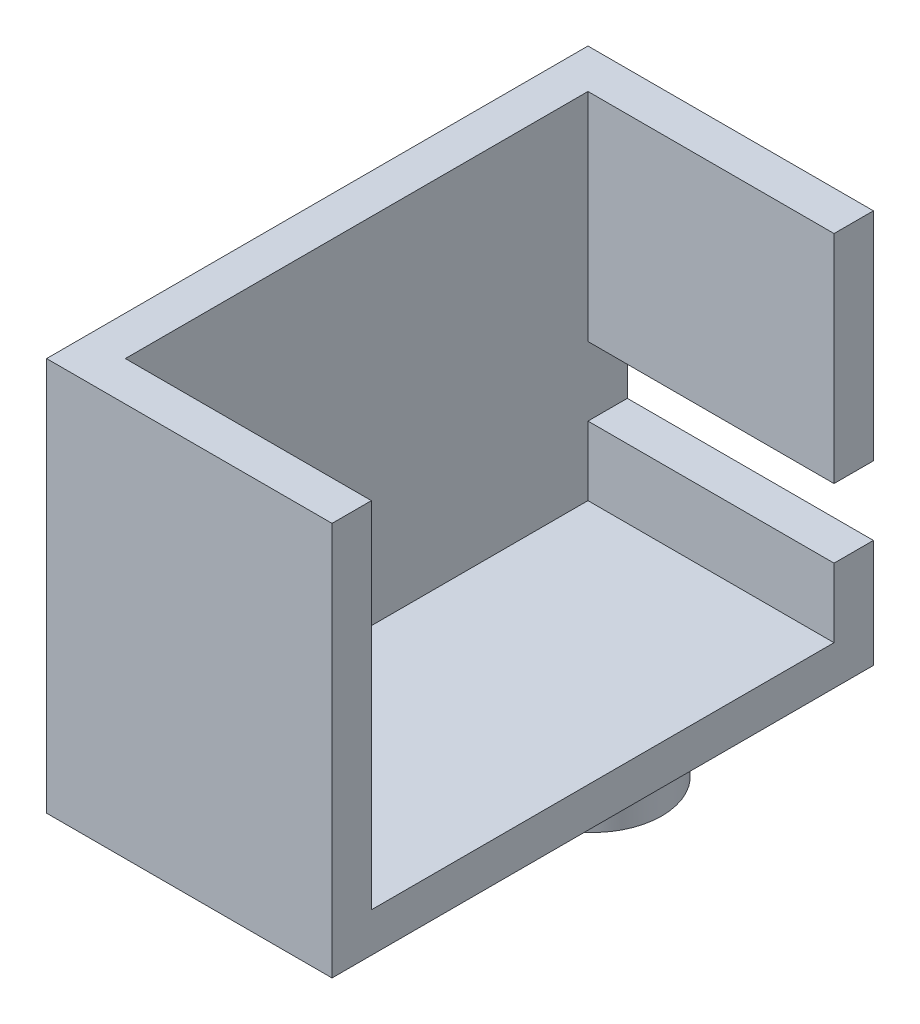
ISO-10303-21;
HEADER;
FILE_DESCRIPTION(('STEP AP214'),'2;1');
FILE_NAME('part.step','',(''),(''),'','','');
FILE_SCHEMA(('AUTOMOTIVE_DESIGN { 1 0 10303 214 1 1 1 1 }'));
ENDSEC;
DATA;
#1=APPLICATION_CONTEXT('core data for automotive mechanical design processes');
#2=APPLICATION_PROTOCOL_DEFINITION('international standard','automotive_design',2000,#1);
#3=PRODUCT_CONTEXT('',#1,'mechanical');
#4=PRODUCT('Part','Part','',(#3));
#5=PRODUCT_RELATED_PRODUCT_CATEGORY('part','',(#4));
#6=PRODUCT_DEFINITION_FORMATION('','',#4);
#7=PRODUCT_DEFINITION_CONTEXT('part definition',#1,'design');
#8=PRODUCT_DEFINITION('design','',#6,#7);
#9=PRODUCT_DEFINITION_SHAPE('','',#8);
#10=(LENGTH_UNIT() NAMED_UNIT(*) SI_UNIT(.MILLI.,.METRE.));
#11=(NAMED_UNIT(*) PLANE_ANGLE_UNIT() SI_UNIT($,.RADIAN.));
#12=(NAMED_UNIT(*) SI_UNIT($,.STERADIAN.) SOLID_ANGLE_UNIT());
#13=UNCERTAINTY_MEASURE_WITH_UNIT(LENGTH_MEASURE(1.E-05),#10,'distance_accuracy_value','');
#14=(GEOMETRIC_REPRESENTATION_CONTEXT(3) GLOBAL_UNCERTAINTY_ASSIGNED_CONTEXT((#13)) GLOBAL_UNIT_ASSIGNED_CONTEXT((#10,
#11,#12)) REPRESENTATION_CONTEXT('',''));
#15=CARTESIAN_POINT('',(0.,0.,0.));
#16=DIRECTION('',(0.,0.,1.));
#17=DIRECTION('',(1.,0.,0.));
#18=AXIS2_PLACEMENT_3D('',#15,#16,#17);
#19=CARTESIAN_POINT('',(12.5,0.,0.));
#20=DIRECTION('',(1.,0.,0.));
#21=DIRECTION('',(0.,0.,-1.));
#22=AXIS2_PLACEMENT_3D('',#19,#20,#21);
#23=PLANE('',#22);
#24=DIRECTION('',(0.,0.,-1.));
#25=VECTOR('',#24,1.);
#26=CARTESIAN_POINT('',(12.5,18.,0.));
#27=LINE('',#26,#25);
#28=CARTESIAN_POINT('',(12.5,18.,25.5));
#29=VERTEX_POINT('',#28);
#30=CARTESIAN_POINT('',(12.5,18.,23.5));
#31=VERTEX_POINT('',#30);
#32=EDGE_CURVE('E218',#29,#31,#27,.T.);
#33=ORIENTED_EDGE('',*,*,#32,.F.);
#34=DIRECTION('',(0.,-1.,0.));
#35=VECTOR('',#34,1.);
#36=CARTESIAN_POINT('',(12.5,0.,25.5));
#37=LINE('',#36,#35);
#38=CARTESIAN_POINT('',(12.5,-2.,25.5));
#39=VERTEX_POINT('',#38);
#40=EDGE_CURVE('E168',#29,#39,#37,.T.);
#41=ORIENTED_EDGE('',*,*,#40,.T.);
#42=DIRECTION('',(0.,0.,-1.));
#43=VECTOR('',#42,1.);
#44=CARTESIAN_POINT('',(12.5,-2.,0.));
#45=LINE('',#44,#43);
#46=CARTESIAN_POINT('',(12.5,-2.,-2.));
#47=VERTEX_POINT('',#46);
#48=EDGE_CURVE('E159',#39,#47,#45,.T.);
#49=ORIENTED_EDGE('',*,*,#48,.T.);
#50=DIRECTION('',(0.,1.,0.));
#51=VECTOR('',#50,1.);
#52=CARTESIAN_POINT('',(12.5,0.,-2.));
#53=LINE('',#52,#51);
#54=CARTESIAN_POINT('',(12.5,3.5,-2.));
#55=VERTEX_POINT('',#54);
#56=EDGE_CURVE('E165',#47,#55,#53,.T.);
#57=ORIENTED_EDGE('',*,*,#56,.T.);
#58=DIRECTION('',(0.,0.,-1.));
#59=VECTOR('',#58,1.);
#60=CARTESIAN_POINT('',(12.5,3.5,-2.));
#61=LINE('',#60,#59);
#62=CARTESIAN_POINT('',(12.5,3.5,0.));
#63=VERTEX_POINT('',#62);
#64=EDGE_CURVE('E190',#63,#55,#61,.T.);
#65=ORIENTED_EDGE('',*,*,#64,.F.);
#66=DIRECTION('',(0.,1.,0.));
#67=VECTOR('',#66,1.);
#68=CARTESIAN_POINT('',(12.5,0.,0.));
#69=LINE('',#68,#67);
#70=CARTESIAN_POINT('',(12.5,0.,0.));
#71=VERTEX_POINT('',#70);
#72=EDGE_CURVE('E196',#71,#63,#69,.T.);
#73=ORIENTED_EDGE('',*,*,#72,.F.);
#74=DIRECTION('',(0.,0.,-1.));
#75=VECTOR('',#74,1.);
#76=CARTESIAN_POINT('',(12.5,0.,0.));
#77=LINE('',#76,#75);
#78=CARTESIAN_POINT('',(12.5,0.,23.5));
#79=VERTEX_POINT('',#78);
#80=EDGE_CURVE('E202',#79,#71,#77,.T.);
#81=ORIENTED_EDGE('',*,*,#80,.F.);
#82=DIRECTION('',(0.,-1.,0.));
#83=VECTOR('',#82,1.);
#84=CARTESIAN_POINT('',(12.5,0.,23.5));
#85=LINE('',#84,#83);
#86=EDGE_CURVE('E199',#31,#79,#85,.T.);
#87=ORIENTED_EDGE('',*,*,#86,.F.);
#88=EDGE_LOOP('',(#33,#41,#49,#57,#65,#73,#81,#87));
#89=FACE_BOUND('',#88,.T.);
#90=ADVANCED_FACE('F34',(#89),#23,.T.);
#91=CARTESIAN_POINT('',(12.5,0.,-2.));
#92=DIRECTION('',(0.,0.,1.));
#93=DIRECTION('',(1.,0.,0.));
#94=AXIS2_PLACEMENT_3D('',#91,#92,#93);
#95=PLANE('',#94);
#96=DIRECTION('',(0.,1.,0.));
#97=VECTOR('',#96,1.);
#98=CARTESIAN_POINT('',(-2.,0.,-2.));
#99=LINE('',#98,#97);
#100=CARTESIAN_POINT('',(-2.,-2.,-2.));
#101=VERTEX_POINT('',#100);
#102=CARTESIAN_POINT('',(-2.,18.,-2.));
#103=VERTEX_POINT('',#102);
#104=EDGE_CURVE('E141',#101,#103,#99,.T.);
#105=ORIENTED_EDGE('',*,*,#104,.T.);
#106=DIRECTION('',(-1.,0.,0.));
#107=VECTOR('',#106,1.);
#108=CARTESIAN_POINT('',(-2.,18.,-2.));
#109=LINE('',#108,#107);
#110=CARTESIAN_POINT('',(12.5,18.,-2.));
#111=VERTEX_POINT('',#110);
#112=EDGE_CURVE('E124',#111,#103,#109,.T.);
#113=ORIENTED_EDGE('',*,*,#112,.F.);
#114=CARTESIAN_POINT('',(12.5,7.,-2.));
#115=VERTEX_POINT('',#114);
#116=EDGE_CURVE('E164',#115,#111,#53,.T.);
#117=ORIENTED_EDGE('',*,*,#116,.F.);
#118=DIRECTION('',(-1.,0.,0.));
#119=VECTOR('',#118,1.);
#120=CARTESIAN_POINT('',(12.5,7.,-2.));
#121=LINE('',#120,#119);
#122=CARTESIAN_POINT('',(0.,7.,-2.));
#123=VERTEX_POINT('',#122);
#124=EDGE_CURVE('E185',#115,#123,#121,.T.);
#125=ORIENTED_EDGE('',*,*,#124,.T.);
#126=DIRECTION('',(0.,1.,0.));
#127=VECTOR('',#126,1.);
#128=CARTESIAN_POINT('',(0.,7.,-2.));
#129=LINE('',#128,#127);
#130=CARTESIAN_POINT('',(0.,3.5,-2.));
#131=VERTEX_POINT('',#130);
#132=EDGE_CURVE('E182',#131,#123,#129,.T.);
#133=ORIENTED_EDGE('',*,*,#132,.F.);
#134=DIRECTION('',(-1.,0.,0.));
#135=VECTOR('',#134,1.);
#136=CARTESIAN_POINT('',(12.5,3.5,-2.));
#137=LINE('',#136,#135);
#138=EDGE_CURVE('E180',#55,#131,#137,.T.);
#139=ORIENTED_EDGE('',*,*,#138,.F.);
#140=ORIENTED_EDGE('',*,*,#56,.F.);
#141=DIRECTION('',(-1.,0.,0.));
#142=VECTOR('',#141,1.);
#143=CARTESIAN_POINT('',(12.5,-2.,-2.));
#144=LINE('',#143,#142);
#145=EDGE_CURVE('E149',#47,#101,#144,.T.);
#146=ORIENTED_EDGE('',*,*,#145,.T.);
#147=EDGE_LOOP('',(#105,#113,#117,#125,#133,#139,#140,#146));
#148=FACE_BOUND('',#147,.T.);
#149=ADVANCED_FACE('F146',(#148),#95,.F.);
#150=CARTESIAN_POINT('',(12.5,18.,0.));
#151=VERTEX_POINT('',#150);
#152=EDGE_CURVE('E130',#151,#111,#27,.T.);
#153=ORIENTED_EDGE('',*,*,#152,.F.);
#154=CARTESIAN_POINT('',(12.5,7.,0.));
#155=VERTEX_POINT('',#154);
#156=EDGE_CURVE('E200',#155,#151,#69,.T.);
#157=ORIENTED_EDGE('',*,*,#156,.F.);
#158=DIRECTION('',(0.,0.,1.));
#159=VECTOR('',#158,1.);
#160=CARTESIAN_POINT('',(12.5,7.,0.));
#161=LINE('',#160,#159);
#162=EDGE_CURVE('E234',#115,#155,#161,.T.);
#163=ORIENTED_EDGE('',*,*,#162,.F.);
#164=ORIENTED_EDGE('',*,*,#116,.T.);
#165=EDGE_LOOP('',(#153,#157,#163,#164));
#166=FACE_BOUND('',#165,.T.);
#167=ADVANCED_FACE('F245',(#166),#23,.T.);
#168=CARTESIAN_POINT('',(12.5,0.,0.));
#169=DIRECTION('',(0.,0.,1.));
#170=DIRECTION('',(1.,0.,0.));
#171=AXIS2_PLACEMENT_3D('',#168,#169,#170);
#172=PLANE('',#171);
#173=DIRECTION('',(0.,1.,0.));
#174=VECTOR('',#173,1.);
#175=CARTESIAN_POINT('',(0.,0.,0.));
#176=LINE('',#175,#174);
#177=CARTESIAN_POINT('',(0.,7.,0.));
#178=VERTEX_POINT('',#177);
#179=CARTESIAN_POINT('',(0.,18.,0.));
#180=VERTEX_POINT('',#179);
#181=EDGE_CURVE('E195',#178,#180,#176,.T.);
#182=ORIENTED_EDGE('',*,*,#181,.F.);
#183=DIRECTION('',(-1.,0.,0.));
#184=VECTOR('',#183,1.);
#185=CARTESIAN_POINT('',(12.5,7.,0.));
#186=LINE('',#185,#184);
#187=EDGE_CURVE('E188',#155,#178,#186,.T.);
#188=ORIENTED_EDGE('',*,*,#187,.F.);
#189=ORIENTED_EDGE('',*,*,#156,.T.);
#190=DIRECTION('',(-1.,0.,0.));
#191=VECTOR('',#190,1.);
#192=CARTESIAN_POINT('',(12.5,18.,0.));
#193=LINE('',#192,#191);
#194=EDGE_CURVE('E150',#151,#180,#193,.T.);
#195=ORIENTED_EDGE('',*,*,#194,.T.);
#196=EDGE_LOOP('',(#182,#188,#189,#195));
#197=FACE_BOUND('',#196,.T.);
#198=ADVANCED_FACE('F249',(#197),#172,.T.);
#199=ORIENTED_EDGE('',*,*,#72,.T.);
#200=DIRECTION('',(-1.,0.,0.));
#201=VECTOR('',#200,1.);
#202=CARTESIAN_POINT('',(12.5,3.5,0.));
#203=LINE('',#202,#201);
#204=CARTESIAN_POINT('',(0.,3.5,0.));
#205=VERTEX_POINT('',#204);
#206=EDGE_CURVE('E184',#63,#205,#203,.T.);
#207=ORIENTED_EDGE('',*,*,#206,.T.);
#208=CARTESIAN_POINT('',(0.,0.,0.));
#209=VERTEX_POINT('',#208);
#210=EDGE_CURVE('E205',#209,#205,#176,.T.);
#211=ORIENTED_EDGE('',*,*,#210,.F.);
#212=DIRECTION('',(-1.,0.,0.));
#213=VECTOR('',#212,1.);
#214=CARTESIAN_POINT('',(12.5,0.,0.));
#215=LINE('',#214,#213);
#216=EDGE_CURVE('E204',#71,#209,#215,.T.);
#217=ORIENTED_EDGE('',*,*,#216,.F.);
#218=EDGE_LOOP('',(#199,#207,#211,#217));
#219=FACE_BOUND('',#218,.T.);
#220=ADVANCED_FACE('F231',(#219),#172,.T.);
#221=CARTESIAN_POINT('',(12.5,0.,25.5));
#222=DIRECTION('',(0.,0.,-1.));
#223=DIRECTION('',(-1.,0.,0.));
#224=AXIS2_PLACEMENT_3D('',#221,#222,#223);
#225=PLANE('',#224);
#226=ORIENTED_EDGE('',*,*,#40,.F.);
#227=DIRECTION('',(1.,0.,0.));
#228=VECTOR('',#227,1.);
#229=CARTESIAN_POINT('',(-2.,18.,25.5));
#230=LINE('',#229,#228);
#231=CARTESIAN_POINT('',(-2.,18.,25.5));
#232=VERTEX_POINT('',#231);
#233=EDGE_CURVE('E143',#232,#29,#230,.T.);
#234=ORIENTED_EDGE('',*,*,#233,.F.);
#235=DIRECTION('',(0.,-1.,0.));
#236=VECTOR('',#235,1.);
#237=CARTESIAN_POINT('',(-2.,0.,25.5));
#238=LINE('',#237,#236);
#239=CARTESIAN_POINT('',(-2.,-2.,25.5));
#240=VERTEX_POINT('',#239);
#241=EDGE_CURVE('E142',#232,#240,#238,.T.);
#242=ORIENTED_EDGE('',*,*,#241,.T.);
#243=DIRECTION('',(-1.,0.,0.));
#244=VECTOR('',#243,1.);
#245=CARTESIAN_POINT('',(12.5,-2.,25.5));
#246=LINE('',#245,#244);
#247=EDGE_CURVE('E42',#39,#240,#246,.T.);
#248=ORIENTED_EDGE('',*,*,#247,.F.);
#249=EDGE_LOOP('',(#226,#234,#242,#248));
#250=FACE_BOUND('',#249,.T.);
#251=ADVANCED_FACE('F257',(#250),#225,.F.);
#252=CARTESIAN_POINT('',(12.5,-2.,0.));
#253=DIRECTION('',(0.,1.,0.));
#254=DIRECTION('',(0.,0.,1.));
#255=AXIS2_PLACEMENT_3D('',#252,#253,#254);
#256=PLANE('',#255);
#257=CARTESIAN_POINT('',(5.25,-2.,5.));
#258=DIRECTION('',(0.,1.,0.));
#259=DIRECTION('',(0.,0.,1.));
#260=AXIS2_PLACEMENT_3D('',#257,#258,#259);
#261=CIRCLE('',#260,3.5);
#262=CARTESIAN_POINT('',(5.25,-2.,8.5));
#263=VERTEX_POINT('',#262);
#264=EDGE_CURVE('E11',#263,#263,#261,.F.);
#265=ORIENTED_EDGE('',*,*,#264,.F.);
#266=EDGE_LOOP('',(#265));
#267=FACE_BOUND('',#266,.T.);
#268=DIRECTION('',(0.,0.,-1.));
#269=VECTOR('',#268,1.);
#270=CARTESIAN_POINT('',(-2.,-2.,0.));
#271=LINE('',#270,#269);
#272=EDGE_CURVE('E152',#240,#101,#271,.T.);
#273=ORIENTED_EDGE('',*,*,#272,.T.);
#274=ORIENTED_EDGE('',*,*,#145,.F.);
#275=ORIENTED_EDGE('',*,*,#48,.F.);
#276=ORIENTED_EDGE('',*,*,#247,.T.);
#277=EDGE_LOOP('',(#273,#274,#275,#276));
#278=FACE_BOUND('',#277,.T.);
#279=ADVANCED_FACE('F176',(#267,#278),#256,.F.);
#280=CARTESIAN_POINT('',(-2.,0.,0.));
#281=DIRECTION('',(1.,0.,0.));
#282=DIRECTION('',(0.,0.,-1.));
#283=AXIS2_PLACEMENT_3D('',#280,#281,#282);
#284=PLANE('',#283);
#285=ORIENTED_EDGE('',*,*,#241,.F.);
#286=DIRECTION('',(0.,0.,1.));
#287=VECTOR('',#286,1.);
#288=CARTESIAN_POINT('',(-2.,18.,-2.));
#289=LINE('',#288,#287);
#290=EDGE_CURVE('E127',#103,#232,#289,.T.);
#291=ORIENTED_EDGE('',*,*,#290,.F.);
#292=ORIENTED_EDGE('',*,*,#104,.F.);
#293=ORIENTED_EDGE('',*,*,#272,.F.);
#294=EDGE_LOOP('',(#285,#291,#292,#293));
#295=FACE_BOUND('',#294,.T.);
#296=ADVANCED_FACE('F36',(#295),#284,.F.);
#297=CARTESIAN_POINT('',(12.5,0.,23.5));
#298=DIRECTION('',(0.,0.,-1.));
#299=DIRECTION('',(-1.,0.,0.));
#300=AXIS2_PLACEMENT_3D('',#297,#298,#299);
#301=PLANE('',#300);
#302=DIRECTION('',(0.,-1.,0.));
#303=VECTOR('',#302,1.);
#304=CARTESIAN_POINT('',(0.,0.,23.5));
#305=LINE('',#304,#303);
#306=CARTESIAN_POINT('',(0.,18.,23.5));
#307=VERTEX_POINT('',#306);
#308=CARTESIAN_POINT('',(0.,0.,23.5));
#309=VERTEX_POINT('',#308);
#310=EDGE_CURVE('E211',#307,#309,#305,.T.);
#311=ORIENTED_EDGE('',*,*,#310,.F.);
#312=DIRECTION('',(-1.,0.,0.));
#313=VECTOR('',#312,1.);
#314=CARTESIAN_POINT('',(12.5,18.,23.5));
#315=LINE('',#314,#313);
#316=EDGE_CURVE('E155',#31,#307,#315,.T.);
#317=ORIENTED_EDGE('',*,*,#316,.F.);
#318=ORIENTED_EDGE('',*,*,#86,.T.);
#319=DIRECTION('',(-1.,0.,0.));
#320=VECTOR('',#319,1.);
#321=CARTESIAN_POINT('',(12.5,0.,23.5));
#322=LINE('',#321,#320);
#323=EDGE_CURVE('E57',#79,#309,#322,.T.);
#324=ORIENTED_EDGE('',*,*,#323,.T.);
#325=EDGE_LOOP('',(#311,#317,#318,#324));
#326=FACE_BOUND('',#325,.T.);
#327=ADVANCED_FACE('F224',(#326),#301,.T.);
#328=CARTESIAN_POINT('',(12.5,0.,0.));
#329=DIRECTION('',(0.,1.,0.));
#330=DIRECTION('',(0.,0.,1.));
#331=AXIS2_PLACEMENT_3D('',#328,#329,#330);
#332=PLANE('',#331);
#333=DIRECTION('',(0.,0.,-1.));
#334=VECTOR('',#333,1.);
#335=CARTESIAN_POINT('',(0.,0.,0.));
#336=LINE('',#335,#334);
#337=EDGE_CURVE('E213',#309,#209,#336,.T.);
#338=ORIENTED_EDGE('',*,*,#337,.F.);
#339=ORIENTED_EDGE('',*,*,#323,.F.);
#340=ORIENTED_EDGE('',*,*,#80,.T.);
#341=ORIENTED_EDGE('',*,*,#216,.T.);
#342=EDGE_LOOP('',(#338,#339,#340,#341));
#343=FACE_BOUND('',#342,.T.);
#344=ADVANCED_FACE('F226',(#343),#332,.T.);
#345=CARTESIAN_POINT('',(0.,0.,0.));
#346=DIRECTION('',(1.,0.,0.));
#347=DIRECTION('',(0.,0.,-1.));
#348=AXIS2_PLACEMENT_3D('',#345,#346,#347);
#349=PLANE('',#348);
#350=ORIENTED_EDGE('',*,*,#210,.T.);
#351=DIRECTION('',(0.,0.,-1.));
#352=VECTOR('',#351,1.);
#353=CARTESIAN_POINT('',(0.,3.5,-2.));
#354=LINE('',#353,#352);
#355=EDGE_CURVE('E229',#205,#131,#354,.T.);
#356=ORIENTED_EDGE('',*,*,#355,.T.);
#357=ORIENTED_EDGE('',*,*,#132,.T.);
#358=DIRECTION('',(0.,0.,1.));
#359=VECTOR('',#358,1.);
#360=CARTESIAN_POINT('',(0.,7.,0.));
#361=LINE('',#360,#359);
#362=EDGE_CURVE('E49',#123,#178,#361,.T.);
#363=ORIENTED_EDGE('',*,*,#362,.T.);
#364=ORIENTED_EDGE('',*,*,#181,.T.);
#365=DIRECTION('',(0.,0.,1.));
#366=VECTOR('',#365,1.);
#367=CARTESIAN_POINT('',(0.,18.,0.));
#368=LINE('',#367,#366);
#369=EDGE_CURVE('E208',#180,#307,#368,.T.);
#370=ORIENTED_EDGE('',*,*,#369,.T.);
#371=ORIENTED_EDGE('',*,*,#310,.T.);
#372=ORIENTED_EDGE('',*,*,#337,.T.);
#373=EDGE_LOOP('',(#350,#356,#357,#363,#364,#370,#371,#372));
#374=FACE_BOUND('',#373,.T.);
#375=ADVANCED_FACE('F222',(#374),#349,.T.);
#376=CARTESIAN_POINT('',(12.5,7.,0.));
#377=DIRECTION('',(0.,-1.,0.));
#378=DIRECTION('',(0.,0.,-1.));
#379=AXIS2_PLACEMENT_3D('',#376,#377,#378);
#380=PLANE('',#379);
#381=ORIENTED_EDGE('',*,*,#362,.F.);
#382=ORIENTED_EDGE('',*,*,#124,.F.);
#383=ORIENTED_EDGE('',*,*,#162,.T.);
#384=ORIENTED_EDGE('',*,*,#187,.T.);
#385=EDGE_LOOP('',(#381,#382,#383,#384));
#386=FACE_BOUND('',#385,.T.);
#387=ADVANCED_FACE('F241',(#386),#380,.T.);
#388=CARTESIAN_POINT('',(12.5,3.5,-2.));
#389=DIRECTION('',(0.,1.,0.));
#390=DIRECTION('',(0.,0.,1.));
#391=AXIS2_PLACEMENT_3D('',#388,#389,#390);
#392=PLANE('',#391);
#393=ORIENTED_EDGE('',*,*,#355,.F.);
#394=ORIENTED_EDGE('',*,*,#206,.F.);
#395=ORIENTED_EDGE('',*,*,#64,.T.);
#396=ORIENTED_EDGE('',*,*,#138,.T.);
#397=EDGE_LOOP('',(#393,#394,#395,#396));
#398=FACE_BOUND('',#397,.T.);
#399=ADVANCED_FACE('F233',(#398),#392,.T.);
#400=CARTESIAN_POINT('',(0.,18.,0.));
#401=DIRECTION('',(0.,-1.,0.));
#402=DIRECTION('',(0.,0.,-1.));
#403=AXIS2_PLACEMENT_3D('',#400,#401,#402);
#404=PLANE('',#403);
#405=ORIENTED_EDGE('',*,*,#32,.T.);
#406=ORIENTED_EDGE('',*,*,#316,.T.);
#407=ORIENTED_EDGE('',*,*,#369,.F.);
#408=ORIENTED_EDGE('',*,*,#194,.F.);
#409=ORIENTED_EDGE('',*,*,#152,.T.);
#410=ORIENTED_EDGE('',*,*,#112,.T.);
#411=ORIENTED_EDGE('',*,*,#290,.T.);
#412=ORIENTED_EDGE('',*,*,#233,.T.);
#413=EDGE_LOOP('',(#405,#406,#407,#408,#409,#410,#411,#412));
#414=FACE_BOUND('',#413,.T.);
#415=ADVANCED_FACE('F126',(#414),#404,.F.);
#416=CARTESIAN_POINT('',(5.25,-7.,5.));
#417=DIRECTION('',(0.,1.,0.));
#418=DIRECTION('',(0.,0.,1.));
#419=AXIS2_PLACEMENT_3D('',#416,#417,#418);
#420=CYLINDRICAL_SURFACE('',#419,3.5);
#421=CARTESIAN_POINT('',(5.25,-7.,5.));
#422=DIRECTION('',(0.,-1.,0.));
#423=DIRECTION('',(0.,0.,-1.));
#424=AXIS2_PLACEMENT_3D('',#421,#422,#423);
#425=CIRCLE('',#424,3.5);
#426=CARTESIAN_POINT('',(5.25,-7.,1.5));
#427=VERTEX_POINT('',#426);
#428=EDGE_CURVE('E135',#427,#427,#425,.T.);
#429=ORIENTED_EDGE('',*,*,#428,.F.);
#430=EDGE_LOOP('',(#429));
#431=FACE_BOUND('',#430,.T.);
#432=ORIENTED_EDGE('',*,*,#264,.T.);
#433=EDGE_LOOP('',(#432));
#434=FACE_BOUND('',#433,.T.);
#435=ADVANCED_FACE('F275',(#431,#434),#420,.T.);
#436=CARTESIAN_POINT('',(5.25,-7.,5.));
#437=DIRECTION('',(0.,-1.,0.));
#438=DIRECTION('',(0.,0.,-1.));
#439=AXIS2_PLACEMENT_3D('',#436,#437,#438);
#440=PLANE('',#439);
#441=ORIENTED_EDGE('',*,*,#428,.T.);
#442=EDGE_LOOP('',(#441));
#443=FACE_BOUND('',#442,.T.);
#444=ADVANCED_FACE('F277',(#443),#440,.T.);
#445=CLOSED_SHELL('',(#90,#149,#167,#198,#220,#251,#279,#296,#327,#344,#375,#387,#399,#415,#435,#444));
#446=MANIFOLD_SOLID_BREP('B2',#445);
#447=ADVANCED_BREP_SHAPE_REPRESENTATION('',(#18,#446),#14);
#448=SHAPE_DEFINITION_REPRESENTATION(#9,#447);
ENDSEC;
END-ISO-10303-21;
